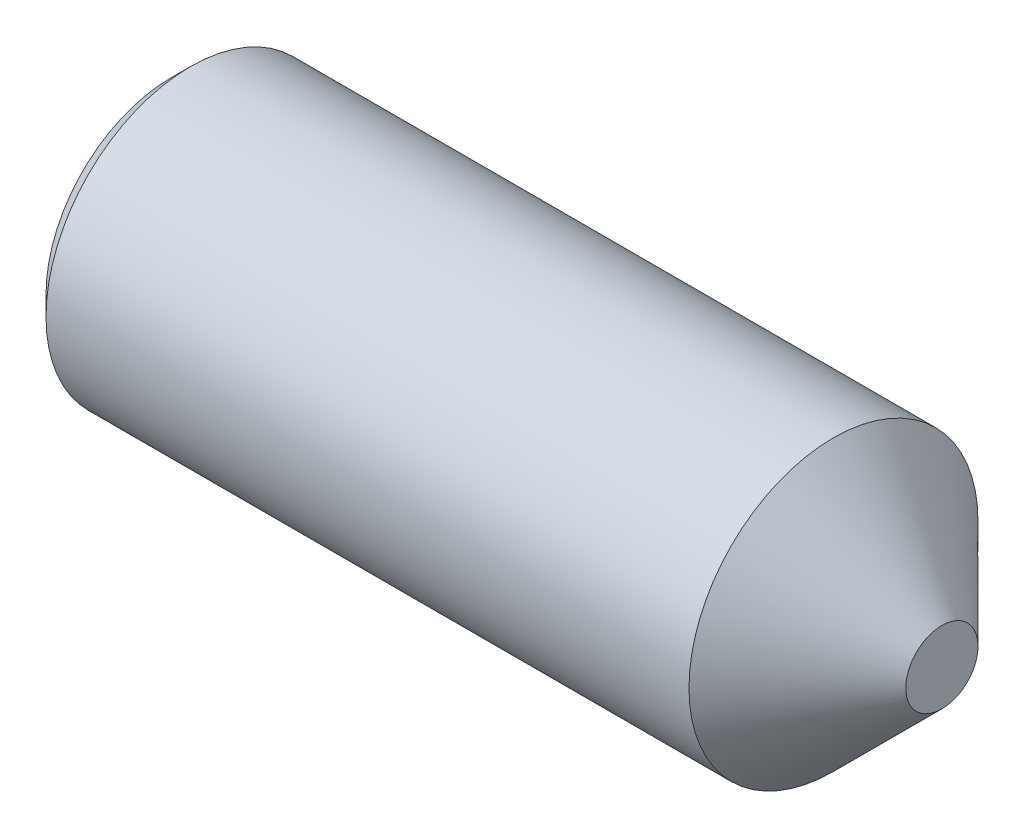
ISO-10303-21;
HEADER;
FILE_DESCRIPTION(('STEP AP214'),'2;1');
FILE_NAME('part.step','',(''),(''),'','','');
FILE_SCHEMA(('AUTOMOTIVE_DESIGN { 1 0 10303 214 1 1 1 1 }'));
ENDSEC;
DATA;
#1=APPLICATION_CONTEXT('core data for automotive mechanical design processes');
#2=APPLICATION_PROTOCOL_DEFINITION('international standard','automotive_design',2000,#1);
#3=PRODUCT_CONTEXT('',#1,'mechanical');
#4=PRODUCT('Part','Part','',(#3));
#5=PRODUCT_RELATED_PRODUCT_CATEGORY('part','',(#4));
#6=PRODUCT_DEFINITION_FORMATION('','',#4);
#7=PRODUCT_DEFINITION_CONTEXT('part definition',#1,'design');
#8=PRODUCT_DEFINITION('design','',#6,#7);
#9=PRODUCT_DEFINITION_SHAPE('','',#8);
#10=(LENGTH_UNIT() NAMED_UNIT(*) SI_UNIT(.MILLI.,.METRE.));
#11=(NAMED_UNIT(*) PLANE_ANGLE_UNIT() SI_UNIT($,.RADIAN.));
#12=(NAMED_UNIT(*) SI_UNIT($,.STERADIAN.) SOLID_ANGLE_UNIT());
#13=UNCERTAINTY_MEASURE_WITH_UNIT(LENGTH_MEASURE(1.E-05),#10,'distance_accuracy_value','');
#14=(GEOMETRIC_REPRESENTATION_CONTEXT(3) GLOBAL_UNCERTAINTY_ASSIGNED_CONTEXT((#13)) GLOBAL_UNIT_ASSIGNED_CONTEXT((#10,
#11,#12)) REPRESENTATION_CONTEXT('',''));
#15=CARTESIAN_POINT('',(0.,0.,0.));
#16=DIRECTION('',(0.,0.,1.));
#17=DIRECTION('',(1.,0.,0.));
#18=AXIS2_PLACEMENT_3D('',#15,#16,#17);
#19=CARTESIAN_POINT('',(1.20000000000042,0.,0.));
#20=DIRECTION('',(-1.,0.,0.));
#21=DIRECTION('',(0.,0.,1.));
#22=AXIS2_PLACEMENT_3D('',#19,#20,#21);
#23=CONICAL_SURFACE('',#22,0.749111974273076,1.04719755119637);
#24=CARTESIAN_POINT('',(1.63250000000004,0.,0.));
#25=VERTEX_POINT('',#24);
#26=VERTEX_LOOP('',#25);
#27=FACE_BOUND('',#26,.T.);
#28=CARTESIAN_POINT('',(1.20000000000017,0.,0.));
#29=DIRECTION('',(-1.,0.,0.));
#30=DIRECTION('',(0.,0.,1.));
#31=AXIS2_PLACEMENT_3D('',#28,#29,#30);
#32=CIRCLE('',#31,0.74911197427352);
#33=CARTESIAN_POINT('',(1.20000000000008,0.374555987136764,-0.648749999999992));
#34=VERTEX_POINT('',#33);
#35=CARTESIAN_POINT('',(1.20000000000008,0.749111974273529,0.));
#36=VERTEX_POINT('',#35);
#37=EDGE_CURVE('E19',#34,#36,#32,.F.);
#38=ORIENTED_EDGE('',*,*,#37,.F.);
#39=CARTESIAN_POINT('',(1.20000000000017,0.,0.));
#40=DIRECTION('',(-1.,0.,0.));
#41=DIRECTION('',(0.,0.,1.));
#42=AXIS2_PLACEMENT_3D('',#39,#40,#41);
#43=CIRCLE('',#42,0.74911197427352);
#44=CARTESIAN_POINT('',(1.20000000000008,-0.374555987136765,-0.648749999999992));
#45=VERTEX_POINT('',#44);
#46=EDGE_CURVE('E89',#45,#34,#43,.F.);
#47=ORIENTED_EDGE('',*,*,#46,.F.);
#48=CARTESIAN_POINT('',(1.20000000000017,0.,0.));
#49=DIRECTION('',(-1.,0.,0.));
#50=DIRECTION('',(0.,0.,1.));
#51=AXIS2_PLACEMENT_3D('',#48,#49,#50);
#52=CIRCLE('',#51,0.74911197427352);
#53=CARTESIAN_POINT('',(1.20000000000008,-0.74911197427353,0.));
#54=VERTEX_POINT('',#53);
#55=EDGE_CURVE('E113',#54,#45,#52,.F.);
#56=ORIENTED_EDGE('',*,*,#55,.F.);
#57=CARTESIAN_POINT('',(1.20000000000017,0.,0.));
#58=DIRECTION('',(-1.,0.,0.));
#59=DIRECTION('',(0.,0.,1.));
#60=AXIS2_PLACEMENT_3D('',#57,#58,#59);
#61=CIRCLE('',#60,0.74911197427352);
#62=CARTESIAN_POINT('',(1.20000000000008,-0.374555987136764,0.648749999999992));
#63=VERTEX_POINT('',#62);
#64=EDGE_CURVE('E154',#63,#54,#61,.F.);
#65=ORIENTED_EDGE('',*,*,#64,.F.);
#66=CARTESIAN_POINT('',(1.20000000000017,0.,0.));
#67=DIRECTION('',(-1.,0.,0.));
#68=DIRECTION('',(0.,0.,1.));
#69=AXIS2_PLACEMENT_3D('',#66,#67,#68);
#70=CIRCLE('',#69,0.74911197427352);
#71=CARTESIAN_POINT('',(1.20000000000008,0.374555987136764,0.648749999999992));
#72=VERTEX_POINT('',#71);
#73=EDGE_CURVE('E151',#72,#63,#70,.F.);
#74=ORIENTED_EDGE('',*,*,#73,.F.);
#75=CARTESIAN_POINT('',(1.20000000000017,0.,0.));
#76=DIRECTION('',(-1.,0.,0.));
#77=DIRECTION('',(0.,0.,1.));
#78=AXIS2_PLACEMENT_3D('',#75,#76,#77);
#79=CIRCLE('',#78,0.74911197427352);
#80=EDGE_CURVE('E92',#36,#72,#79,.F.);
#81=ORIENTED_EDGE('',*,*,#80,.F.);
#82=EDGE_LOOP('',(#38,#47,#56,#65,#74,#81));
#83=FACE_BOUND('',#82,.T.);
#84=ADVANCED_FACE('F16',(#27,#83),#23,.F.);
#85=CARTESIAN_POINT('',(1.2,0.749111974273539,1.2975));
#86=DIRECTION('',(-1.,0.,0.));
#87=DIRECTION('',(0.,0.,1.));
#88=AXIS2_PLACEMENT_3D('',#85,#86,#87);
#89=PLANE('',#88);
#90=DIRECTION('',(0.,0.,1.));
#91=VECTOR('',#90,1.);
#92=CARTESIAN_POINT('',(1.2,0.749111974273539,0.4325));
#93=LINE('',#92,#91);
#94=CARTESIAN_POINT('',(1.2,0.749111974273539,-0.432500000000001));
#95=VERTEX_POINT('',#94);
#96=EDGE_CURVE('E99',#36,#95,#93,.F.);
#97=ORIENTED_EDGE('',*,*,#96,.T.);
#98=DIRECTION('',(0.,0.866025403784439,0.5));
#99=VECTOR('',#98,1.);
#100=CARTESIAN_POINT('',(1.2,0.749111974273539,-0.432500000000001));
#101=LINE('',#100,#99);
#102=EDGE_CURVE('E97',#95,#34,#101,.F.);
#103=ORIENTED_EDGE('',*,*,#102,.T.);
#104=ORIENTED_EDGE('',*,*,#37,.T.);
#105=EDGE_LOOP('',(#97,#103,#104));
#106=FACE_BOUND('',#105,.T.);
#107=ADVANCED_FACE('F98',(#106),#89,.T.);
#108=CARTESIAN_POINT('',(1.2,0.749111974273539,1.2975));
#109=DIRECTION('',(-1.,0.,0.));
#110=DIRECTION('',(0.,0.,1.));
#111=AXIS2_PLACEMENT_3D('',#108,#109,#110);
#112=PLANE('',#111);
#113=DIRECTION('',(0.,0.866025403784439,0.5));
#114=VECTOR('',#113,1.);
#115=CARTESIAN_POINT('',(1.2,0.749111974273539,-0.432500000000001));
#116=LINE('',#115,#114);
#117=CARTESIAN_POINT('',(1.2,0.,-0.865));
#118=VERTEX_POINT('',#117);
#119=EDGE_CURVE('E104',#34,#118,#116,.F.);
#120=ORIENTED_EDGE('',*,*,#119,.T.);
#121=DIRECTION('',(0.,0.866025403784439,-0.5));
#122=VECTOR('',#121,1.);
#123=CARTESIAN_POINT('',(1.2,0.,-0.865));
#124=LINE('',#123,#122);
#125=EDGE_CURVE('E111',#118,#45,#124,.F.);
#126=ORIENTED_EDGE('',*,*,#125,.T.);
#127=ORIENTED_EDGE('',*,*,#46,.T.);
#128=EDGE_LOOP('',(#120,#126,#127));
#129=FACE_BOUND('',#128,.T.);
#130=ADVANCED_FACE('F108',(#129),#112,.T.);
#131=CARTESIAN_POINT('',(1.2,0.749111974273539,1.2975));
#132=DIRECTION('',(-1.,0.,0.));
#133=DIRECTION('',(0.,0.,1.));
#134=AXIS2_PLACEMENT_3D('',#131,#132,#133);
#135=PLANE('',#134);
#136=DIRECTION('',(0.,0.866025403784439,-0.5));
#137=VECTOR('',#136,1.);
#138=CARTESIAN_POINT('',(1.2,0.,-0.865));
#139=LINE('',#138,#137);
#140=CARTESIAN_POINT('',(1.2,-0.74911197427354,-0.4325));
#141=VERTEX_POINT('',#140);
#142=EDGE_CURVE('E161',#45,#141,#139,.F.);
#143=ORIENTED_EDGE('',*,*,#142,.T.);
#144=DIRECTION('',(0.,0.,-1.));
#145=VECTOR('',#144,1.);
#146=CARTESIAN_POINT('',(1.2,-0.74911197427354,-0.4325));
#147=LINE('',#146,#145);
#148=EDGE_CURVE('E164',#141,#54,#147,.F.);
#149=ORIENTED_EDGE('',*,*,#148,.T.);
#150=ORIENTED_EDGE('',*,*,#55,.T.);
#151=EDGE_LOOP('',(#143,#149,#150));
#152=FACE_BOUND('',#151,.T.);
#153=ADVANCED_FACE('F160',(#152),#135,.T.);
#154=CARTESIAN_POINT('',(1.2,0.749111974273539,1.2975));
#155=DIRECTION('',(-1.,0.,0.));
#156=DIRECTION('',(0.,0.,1.));
#157=AXIS2_PLACEMENT_3D('',#154,#155,#156);
#158=PLANE('',#157);
#159=DIRECTION('',(0.,0.,-1.));
#160=VECTOR('',#159,1.);
#161=CARTESIAN_POINT('',(1.2,-0.74911197427354,-0.4325));
#162=LINE('',#161,#160);
#163=CARTESIAN_POINT('',(1.2,-0.74911197427354,0.432499999999999));
#164=VERTEX_POINT('',#163);
#165=EDGE_CURVE('E195',#54,#164,#162,.F.);
#166=ORIENTED_EDGE('',*,*,#165,.T.);
#167=DIRECTION('',(0.,-0.866025403784439,-0.5));
#168=VECTOR('',#167,1.);
#169=CARTESIAN_POINT('',(1.2,-0.74911197427354,0.432499999999999));
#170=LINE('',#169,#168);
#171=EDGE_CURVE('E201',#164,#63,#170,.F.);
#172=ORIENTED_EDGE('',*,*,#171,.T.);
#173=ORIENTED_EDGE('',*,*,#64,.T.);
#174=EDGE_LOOP('',(#166,#172,#173));
#175=FACE_BOUND('',#174,.T.);
#176=ADVANCED_FACE('F385',(#175),#158,.T.);
#177=CARTESIAN_POINT('',(1.2,0.749111974273539,1.2975));
#178=DIRECTION('',(-1.,0.,0.));
#179=DIRECTION('',(0.,0.,1.));
#180=AXIS2_PLACEMENT_3D('',#177,#178,#179);
#181=PLANE('',#180);
#182=DIRECTION('',(0.,-0.866025403784439,-0.5));
#183=VECTOR('',#182,1.);
#184=CARTESIAN_POINT('',(1.2,-0.74911197427354,0.432499999999999));
#185=LINE('',#184,#183);
#186=CARTESIAN_POINT('',(1.2,0.,0.864999999999999));
#187=VERTEX_POINT('',#186);
#188=EDGE_CURVE('E209',#63,#187,#185,.F.);
#189=ORIENTED_EDGE('',*,*,#188,.T.);
#190=DIRECTION('',(0.,-0.866025403784439,0.5));
#191=VECTOR('',#190,1.);
#192=CARTESIAN_POINT('',(1.2,0.,0.864999999999999));
#193=LINE('',#192,#191);
#194=EDGE_CURVE('E223',#187,#72,#193,.F.);
#195=ORIENTED_EDGE('',*,*,#194,.T.);
#196=ORIENTED_EDGE('',*,*,#73,.T.);
#197=EDGE_LOOP('',(#189,#195,#196));
#198=FACE_BOUND('',#197,.T.);
#199=ADVANCED_FACE('F274',(#198),#181,.T.);
#200=CARTESIAN_POINT('',(1.2,0.749111974273539,1.2975));
#201=DIRECTION('',(-1.,0.,0.));
#202=DIRECTION('',(0.,0.,1.));
#203=AXIS2_PLACEMENT_3D('',#200,#201,#202);
#204=PLANE('',#203);
#205=DIRECTION('',(0.,-0.866025403784439,0.5));
#206=VECTOR('',#205,1.);
#207=CARTESIAN_POINT('',(1.2,0.,0.864999999999999));
#208=LINE('',#207,#206);
#209=CARTESIAN_POINT('',(1.2,0.749111974273539,0.4325));
#210=VERTEX_POINT('',#209);
#211=EDGE_CURVE('E228',#72,#210,#208,.F.);
#212=ORIENTED_EDGE('',*,*,#211,.T.);
#213=DIRECTION('',(0.,0.,1.));
#214=VECTOR('',#213,1.);
#215=CARTESIAN_POINT('',(1.2,0.749111974273539,0.4325));
#216=LINE('',#215,#214);
#217=EDGE_CURVE('E136',#210,#36,#216,.F.);
#218=ORIENTED_EDGE('',*,*,#217,.T.);
#219=ORIENTED_EDGE('',*,*,#80,.T.);
#220=EDGE_LOOP('',(#212,#218,#219));
#221=FACE_BOUND('',#220,.T.);
#222=ADVANCED_FACE('F272',(#221),#204,.T.);
#223=CARTESIAN_POINT('',(1.2,0.749111974273539,0.4325));
#224=DIRECTION('',(0.,1.,0.));
#225=DIRECTION('',(0.,0.,1.));
#226=AXIS2_PLACEMENT_3D('',#223,#224,#225);
#227=PLANE('',#226);
#228=DIRECTION('',(1.,0.,0.));
#229=VECTOR('',#228,1.);
#230=CARTESIAN_POINT('',(1.2,0.749111974273539,-0.432500000000001));
#231=LINE('',#230,#229);
#232=CARTESIAN_POINT('',(0.,0.749111974273539,-0.432500000000001));
#233=VERTEX_POINT('',#232);
#234=EDGE_CURVE('E105',#233,#95,#231,.T.);
#235=ORIENTED_EDGE('',*,*,#234,.T.);
#236=ORIENTED_EDGE('',*,*,#96,.F.);
#237=ORIENTED_EDGE('',*,*,#217,.F.);
#238=DIRECTION('',(1.,0.,0.));
#239=VECTOR('',#238,1.);
#240=CARTESIAN_POINT('',(1.2,0.749111974273539,0.4325));
#241=LINE('',#240,#239);
#242=CARTESIAN_POINT('',(0.,0.749111974273539,0.4325));
#243=VERTEX_POINT('',#242);
#244=EDGE_CURVE('E140',#210,#243,#241,.F.);
#245=ORIENTED_EDGE('',*,*,#244,.T.);
#246=DIRECTION('',(0.,0.,-1.));
#247=VECTOR('',#246,1.);
#248=CARTESIAN_POINT('',(0.,0.749111974273539,0.));
#249=LINE('',#248,#247);
#250=EDGE_CURVE('E127',#243,#233,#249,.T.);
#251=ORIENTED_EDGE('',*,*,#250,.T.);
#252=EDGE_LOOP('',(#235,#236,#237,#245,#251));
#253=FACE_BOUND('',#252,.T.);
#254=ADVANCED_FACE('F270',(#253),#227,.F.);
#255=CARTESIAN_POINT('',(1.2,0.749111974273539,-0.432500000000001));
#256=DIRECTION('',(0.,0.5,-0.866025403784439));
#257=DIRECTION('',(0.,0.866025403784439,0.5));
#258=AXIS2_PLACEMENT_3D('',#255,#256,#257);
#259=PLANE('',#258);
#260=DIRECTION('',(1.,0.,0.));
#261=VECTOR('',#260,1.);
#262=CARTESIAN_POINT('',(1.2,0.,-0.865));
#263=LINE('',#262,#261);
#264=CARTESIAN_POINT('',(0.,0.,-0.865));
#265=VERTEX_POINT('',#264);
#266=EDGE_CURVE('E116',#265,#118,#263,.T.);
#267=ORIENTED_EDGE('',*,*,#266,.T.);
#268=ORIENTED_EDGE('',*,*,#119,.F.);
#269=ORIENTED_EDGE('',*,*,#102,.F.);
#270=ORIENTED_EDGE('',*,*,#234,.F.);
#271=DIRECTION('',(0.,-0.866025403784439,-0.5));
#272=VECTOR('',#271,1.);
#273=CARTESIAN_POINT('',(0.,0.749111974273539,-0.432500000000001));
#274=LINE('',#273,#272);
#275=EDGE_CURVE('E124',#233,#265,#274,.T.);
#276=ORIENTED_EDGE('',*,*,#275,.T.);
#277=EDGE_LOOP('',(#267,#268,#269,#270,#276));
#278=FACE_BOUND('',#277,.T.);
#279=ADVANCED_FACE('F114',(#278),#259,.F.);
#280=CARTESIAN_POINT('',(1.2,0.,-0.865));
#281=DIRECTION('',(0.,-0.5,-0.866025403784439));
#282=DIRECTION('',(0.,0.866025403784439,-0.5));
#283=AXIS2_PLACEMENT_3D('',#280,#281,#282);
#284=PLANE('',#283);
#285=DIRECTION('',(1.,0.,0.));
#286=VECTOR('',#285,1.);
#287=CARTESIAN_POINT('',(1.2,-0.74911197427354,-0.4325));
#288=LINE('',#287,#286);
#289=CARTESIAN_POINT('',(0.,-0.74911197427354,-0.4325));
#290=VERTEX_POINT('',#289);
#291=EDGE_CURVE('E168',#290,#141,#288,.T.);
#292=ORIENTED_EDGE('',*,*,#291,.T.);
#293=ORIENTED_EDGE('',*,*,#142,.F.);
#294=ORIENTED_EDGE('',*,*,#125,.F.);
#295=ORIENTED_EDGE('',*,*,#266,.F.);
#296=DIRECTION('',(0.,-0.866025403784439,0.5));
#297=VECTOR('',#296,1.);
#298=CARTESIAN_POINT('',(0.,0.,-0.865));
#299=LINE('',#298,#297);
#300=EDGE_CURVE('E126',#265,#290,#299,.T.);
#301=ORIENTED_EDGE('',*,*,#300,.T.);
#302=EDGE_LOOP('',(#292,#293,#294,#295,#301));
#303=FACE_BOUND('',#302,.T.);
#304=ADVANCED_FACE('F166',(#303),#284,.F.);
#305=CARTESIAN_POINT('',(1.2,-0.74911197427354,-0.4325));
#306=DIRECTION('',(0.,-1.,0.));
#307=DIRECTION('',(0.,0.,-1.));
#308=AXIS2_PLACEMENT_3D('',#305,#306,#307);
#309=PLANE('',#308);
#310=DIRECTION('',(1.,0.,0.));
#311=VECTOR('',#310,1.);
#312=CARTESIAN_POINT('',(1.2,-0.74911197427354,0.432499999999999));
#313=LINE('',#312,#311);
#314=CARTESIAN_POINT('',(0.,-0.74911197427354,0.432499999999999));
#315=VERTEX_POINT('',#314);
#316=EDGE_CURVE('E197',#315,#164,#313,.T.);
#317=ORIENTED_EDGE('',*,*,#316,.T.);
#318=ORIENTED_EDGE('',*,*,#165,.F.);
#319=ORIENTED_EDGE('',*,*,#148,.F.);
#320=ORIENTED_EDGE('',*,*,#291,.F.);
#321=DIRECTION('',(0.,0.,-1.));
#322=VECTOR('',#321,1.);
#323=CARTESIAN_POINT('',(0.,-0.74911197427354,0.));
#324=LINE('',#323,#322);
#325=EDGE_CURVE('E178',#290,#315,#324,.F.);
#326=ORIENTED_EDGE('',*,*,#325,.T.);
#327=EDGE_LOOP('',(#317,#318,#319,#320,#326));
#328=FACE_BOUND('',#327,.T.);
#329=ADVANCED_FACE('F279',(#328),#309,.F.);
#330=CARTESIAN_POINT('',(1.2,-0.74911197427354,0.432499999999999));
#331=DIRECTION('',(0.,-0.5,0.866025403784439));
#332=DIRECTION('',(0.,-0.866025403784439,-0.5));
#333=AXIS2_PLACEMENT_3D('',#330,#331,#332);
#334=PLANE('',#333);
#335=DIRECTION('',(1.,0.,0.));
#336=VECTOR('',#335,1.);
#337=CARTESIAN_POINT('',(1.2,0.,0.864999999999999));
#338=LINE('',#337,#336);
#339=CARTESIAN_POINT('',(0.,0.,0.864999999999999));
#340=VERTEX_POINT('',#339);
#341=EDGE_CURVE('E219',#340,#187,#338,.T.);
#342=ORIENTED_EDGE('',*,*,#341,.T.);
#343=ORIENTED_EDGE('',*,*,#188,.F.);
#344=ORIENTED_EDGE('',*,*,#171,.F.);
#345=ORIENTED_EDGE('',*,*,#316,.F.);
#346=DIRECTION('',(0.,0.866025403784439,0.5));
#347=VECTOR('',#346,1.);
#348=CARTESIAN_POINT('',(0.,-0.74911197427354,0.432499999999999));
#349=LINE('',#348,#347);
#350=EDGE_CURVE('E34',#315,#340,#349,.T.);
#351=ORIENTED_EDGE('',*,*,#350,.T.);
#352=EDGE_LOOP('',(#342,#343,#344,#345,#351));
#353=FACE_BOUND('',#352,.T.);
#354=ADVANCED_FACE('F277',(#353),#334,.F.);
#355=CARTESIAN_POINT('',(1.2,0.,0.864999999999999));
#356=DIRECTION('',(0.,0.5,0.866025403784439));
#357=DIRECTION('',(0.,-0.866025403784439,0.5));
#358=AXIS2_PLACEMENT_3D('',#355,#356,#357);
#359=PLANE('',#358);
#360=ORIENTED_EDGE('',*,*,#244,.F.);
#361=ORIENTED_EDGE('',*,*,#211,.F.);
#362=ORIENTED_EDGE('',*,*,#194,.F.);
#363=ORIENTED_EDGE('',*,*,#341,.F.);
#364=DIRECTION('',(0.,0.866025403784439,-0.5));
#365=VECTOR('',#364,1.);
#366=CARTESIAN_POINT('',(0.,0.,0.864999999999999));
#367=LINE('',#366,#365);
#368=EDGE_CURVE('E149',#340,#243,#367,.T.);
#369=ORIENTED_EDGE('',*,*,#368,.T.);
#370=EDGE_LOOP('',(#360,#361,#362,#363,#369));
#371=FACE_BOUND('',#370,.T.);
#372=ADVANCED_FACE('F259',(#371),#359,.F.);
#373=CARTESIAN_POINT('',(0.,1.299,0.));
#374=DIRECTION('',(1.,0.,0.));
#375=DIRECTION('',(0.,0.,-1.));
#376=AXIS2_PLACEMENT_3D('',#373,#374,#375);
#377=PLANE('',#376);
#378=CARTESIAN_POINT('',(0.,0.,0.));
#379=DIRECTION('',(1.,0.,0.));
#380=DIRECTION('',(0.,1.,0.));
#381=AXIS2_PLACEMENT_3D('',#378,#379,#380);
#382=CIRCLE('',#381,1.29899999996042);
#383=CARTESIAN_POINT('',(0.,1.29899999996042,0.));
#384=VERTEX_POINT('',#383);
#385=EDGE_CURVE('E146',#384,#384,#382,.T.);
#386=ORIENTED_EDGE('',*,*,#385,.F.);
#387=EDGE_LOOP('',(#386));
#388=FACE_BOUND('',#387,.T.);
#389=ORIENTED_EDGE('',*,*,#350,.F.);
#390=ORIENTED_EDGE('',*,*,#325,.F.);
#391=ORIENTED_EDGE('',*,*,#300,.F.);
#392=ORIENTED_EDGE('',*,*,#275,.F.);
#393=ORIENTED_EDGE('',*,*,#250,.F.);
#394=ORIENTED_EDGE('',*,*,#368,.F.);
#395=EDGE_LOOP('',(#389,#390,#391,#392,#393,#394));
#396=FACE_BOUND('',#395,.T.);
#397=ADVANCED_FACE('F256',(#388,#396),#377,.F.);
#398=CARTESIAN_POINT('',(8.,0.,0.));
#399=DIRECTION('',(-1.,0.,0.));
#400=DIRECTION('',(0.,0.,1.));
#401=AXIS2_PLACEMENT_3D('',#398,#399,#400);
#402=PLANE('',#401);
#403=CARTESIAN_POINT('',(8.0000000000382,0.,0.));
#404=DIRECTION('',(-1.,0.,0.));
#405=DIRECTION('',(0.,-1.,0.));
#406=AXIS2_PLACEMENT_3D('',#403,#404,#405);
#407=CIRCLE('',#406,0.374999999962711);
#408=CARTESIAN_POINT('',(8.0000000000382,-0.37499999996271,0.));
#409=VERTEX_POINT('',#408);
#410=EDGE_CURVE('E143',#409,#409,#407,.T.);
#411=ORIENTED_EDGE('',*,*,#410,.F.);
#412=EDGE_LOOP('',(#411));
#413=FACE_BOUND('',#412,.T.);
#414=ADVANCED_FACE('F252',(#413),#402,.F.);
#415=CARTESIAN_POINT('',(0.200999999947271,0.,0.));
#416=DIRECTION('',(1.,0.,0.));
#417=DIRECTION('',(0.,1.,0.));
#418=AXIS2_PLACEMENT_3D('',#415,#416,#417);
#419=CONICAL_SURFACE('',#418,1.49999999990769,0.785398163397448);
#420=CARTESIAN_POINT('',(0.200999999999998,0.,0.));
#421=DIRECTION('',(-1.,0.,0.));
#422=DIRECTION('',(0.,0.,1.));
#423=AXIS2_PLACEMENT_3D('',#420,#421,#422);
#424=CIRCLE('',#423,1.5);
#425=CARTESIAN_POINT('',(0.200999999999998,0.,1.5));
#426=VERTEX_POINT('',#425);
#427=EDGE_CURVE('E25',#426,#426,#424,.F.);
#428=ORIENTED_EDGE('',*,*,#427,.F.);
#429=EDGE_LOOP('',(#428));
#430=FACE_BOUND('',#429,.T.);
#431=ORIENTED_EDGE('',*,*,#385,.T.);
#432=EDGE_LOOP('',(#431));
#433=FACE_BOUND('',#432,.T.);
#434=ADVANCED_FACE('F248',(#430,#433),#419,.T.);
#435=CARTESIAN_POINT('',(6.87500000009322,0.,0.));
#436=DIRECTION('',(-1.,0.,0.));
#437=DIRECTION('',(0.,-1.,0.));
#438=AXIS2_PLACEMENT_3D('',#435,#436,#437);
#439=CONICAL_SURFACE('',#438,1.49999999990769,0.785398163397448);
#440=CARTESIAN_POINT('',(6.87499999999999,0.,0.));
#441=DIRECTION('',(-1.,0.,0.));
#442=DIRECTION('',(0.,0.,1.));
#443=AXIS2_PLACEMENT_3D('',#440,#441,#442);
#444=CIRCLE('',#443,1.5);
#445=CARTESIAN_POINT('',(6.87499999999999,-1.50000000000092,0.));
#446=VERTEX_POINT('',#445);
#447=EDGE_CURVE('E11',#446,#446,#444,.T.);
#448=CARTESIAN_POINT('',(8.0000000000382,-0.37499999996271,0.));
#449=CARTESIAN_POINT('',(7.9882812500378,-0.386718749963108,0.));
#450=CARTESIAN_POINT('',(7.9765625000374,-0.398437499963506,0.));
#451=CARTESIAN_POINT('',(7.95312500003661,-0.421874999964302,0.));
#452=CARTESIAN_POINT('',(7.94140625003621,-0.4335937499647,0.));
#453=CARTESIAN_POINT('',(7.91796875003541,-0.457031249965496,0.));
#454=CARTESIAN_POINT('',(7.90625000003502,-0.468749999965894,0.));
#455=CARTESIAN_POINT('',(7.88281250003422,-0.49218749996669,0.));
#456=CARTESIAN_POINT('',(7.87109375003382,-0.503906249967088,0.));
#457=CARTESIAN_POINT('',(7.84765625003303,-0.527343749967884,0.));
#458=CARTESIAN_POINT('',(7.83593750003263,-0.539062499968282,0.));
#459=CARTESIAN_POINT('',(7.81250000003183,-0.562499999969078,0.));
#460=CARTESIAN_POINT('',(7.80078125003143,-0.574218749969476,0.));
#461=CARTESIAN_POINT('',(7.77734375003064,-0.597656249970272,0.));
#462=CARTESIAN_POINT('',(7.76562500003024,-0.60937499997067,0.));
#463=CARTESIAN_POINT('',(7.74218750002944,-0.632812499971466,0.));
#464=CARTESIAN_POINT('',(7.73046875002905,-0.644531249971864,0.));
#465=CARTESIAN_POINT('',(7.70703125002825,-0.66796874997266,0.));
#466=CARTESIAN_POINT('',(7.69531250002785,-0.679687499973058,0.));
#467=CARTESIAN_POINT('',(7.67187500002706,-0.703124999973854,0.));
#468=CARTESIAN_POINT('',(7.66015625002666,-0.714843749974252,0.));
#469=CARTESIAN_POINT('',(7.63671875002586,-0.738281249975048,0.));
#470=CARTESIAN_POINT('',(7.62500000002546,-0.749999999975446,0.));
#471=CARTESIAN_POINT('',(7.60156250002467,-0.773437499976242,0.));
#472=CARTESIAN_POINT('',(7.58984375002427,-0.78515624997664,0.));
#473=CARTESIAN_POINT('',(7.56640625002347,-0.808593749977436,0.));
#474=CARTESIAN_POINT('',(7.55468750002307,-0.820312499977834,0.));
#475=CARTESIAN_POINT('',(7.53125000002228,-0.84374999997863,0.));
#476=CARTESIAN_POINT('',(7.51953125002188,-0.855468749979028,0.));
#477=CARTESIAN_POINT('',(7.49609375002109,-0.878906249979824,0.));
#478=CARTESIAN_POINT('',(7.48437500002069,-0.890624999980222,0.));
#479=CARTESIAN_POINT('',(7.46093750001989,-0.914062499981018,0.));
#480=CARTESIAN_POINT('',(7.44921875001949,-0.925781249981416,0.));
#481=CARTESIAN_POINT('',(7.4257812500187,-0.949218749982212,0.));
#482=CARTESIAN_POINT('',(7.4140625000183,-0.96093749998261,0.));
#483=CARTESIAN_POINT('',(7.3906250000175,-0.984374999983406,0.));
#484=CARTESIAN_POINT('',(7.37890625001711,-0.996093749983804,0.));
#485=CARTESIAN_POINT('',(7.35546875001631,-1.0195312499846,0.));
#486=CARTESIAN_POINT('',(7.34375000001591,-1.031249999985,0.));
#487=CARTESIAN_POINT('',(7.32031250001512,-1.05468749998579,0.));
#488=CARTESIAN_POINT('',(7.30859375001472,-1.06640624998619,0.));
#489=CARTESIAN_POINT('',(7.28515625001392,-1.08984374998699,0.));
#490=CARTESIAN_POINT('',(7.27343750001352,-1.10156249998739,0.));
#491=CARTESIAN_POINT('',(7.25000000001273,-1.12499999998818,0.));
#492=CARTESIAN_POINT('',(7.23828125001233,-1.13671874998858,0.));
#493=CARTESIAN_POINT('',(7.21484375001153,-1.16015624998938,0.));
#494=CARTESIAN_POINT('',(7.20312500001113,-1.17187499998977,0.));
#495=CARTESIAN_POINT('',(7.17968750001034,-1.19531249999057,0.));
#496=CARTESIAN_POINT('',(7.16796875000994,-1.20703124999097,0.));
#497=CARTESIAN_POINT('',(7.14453125000915,-1.23046874999176,0.));
#498=CARTESIAN_POINT('',(7.13281250000875,-1.24218749999216,0.));
#499=CARTESIAN_POINT('',(7.10937500000795,-1.26562499999296,0.));
#500=CARTESIAN_POINT('',(7.09765625000755,-1.27734374999336,0.));
#501=CARTESIAN_POINT('',(7.07421875000676,-1.30078124999415,0.));
#502=CARTESIAN_POINT('',(7.06250000000636,-1.31249999999455,0.));
#503=CARTESIAN_POINT('',(7.03906250000556,-1.33593749999535,0.));
#504=CARTESIAN_POINT('',(7.02734375000516,-1.34765624999574,0.));
#505=CARTESIAN_POINT('',(7.00390625000437,-1.37109374999654,0.));
#506=CARTESIAN_POINT('',(6.99218750000397,-1.38281249999694,0.));
#507=CARTESIAN_POINT('',(6.96875000000318,-1.40624999999773,0.));
#508=CARTESIAN_POINT('',(6.95703125000278,-1.41796874999813,0.));
#509=CARTESIAN_POINT('',(6.93359375000198,-1.44140624999893,0.));
#510=CARTESIAN_POINT('',(6.92187500000158,-1.45312499999933,0.));
#511=CARTESIAN_POINT('',(6.89843750000079,-1.47656250000012,0.));
#512=CARTESIAN_POINT('',(6.88671875000039,-1.48828125000052,0.));
#513=CARTESIAN_POINT('',(6.87499999999999,-1.50000000000092,0.));
#514=B_SPLINE_CURVE_WITH_KNOTS('',3,(#448,#449,#450,#451,#452,#453,#454,#455,#456,#457,#458,
#459,#460,#461,#462,#463,#464,#465,#466,#467,#468,#469,#470,#471,#472,#473,#474,#475,#476,#477,
#478,#479,#480,#481,#482,#483,#484,#485,#486,#487,#488,#489,#490,#491,#492,#493,#494,#495,#496,
#497,#498,#499,#500,#501,#502,#503,#504,#505,#506,#507,#508,#509,#510,#511,#512,#513),
.UNSPECIFIED.,.F.,.F.,(4,2,2,2,2,2,2,2,2,2,2,2,2,2,2,2,2,2,2,2,2,2,2,2,2,2,2,2,2,2,2,2,4),(0.,
0.049718445553867,0.0994368911077354,0.149155336661602,0.198873782215471,0.248592227769338,
0.298310673323206,0.348029118877073,0.397747564430941,0.447466009984809,0.497184455538677,
0.546902901092544,0.596621346646412,0.64633979220028,0.696058237754147,0.745776683308015,
0.795495128861883,0.845213574415751,0.894932019969618,0.944650465523486,0.994368911077353,
1.04408735663122,1.09380580218509,1.14352424773896,1.19324269329282,1.24296113884669,
1.29267958440056,1.34239802995443,1.3921164755083,1.44183492106216,1.49155336661603,
1.5412718121699,1.59099025772377),.UNSPECIFIED.);
#515=EDGE_CURVE('BSEAM251',#409,#446,#514,.T.);
#516=ORIENTED_EDGE('',*,*,#410,.T.);
#517=ORIENTED_EDGE('',*,*,#447,.F.);
#518=ORIENTED_EDGE('',*,*,#515,.T.);
#519=ORIENTED_EDGE('',*,*,#515,.F.);
#520=EDGE_LOOP('',(#516,#518,#517,#519));
#521=FACE_BOUND('',#520,.T.);
#522=ADVANCED_FACE('F251',(#521),#439,.T.);
#523=CARTESIAN_POINT('',(-1.4104518001455,0.,0.));
#524=DIRECTION('',(-1.,0.,0.));
#525=DIRECTION('',(0.,0.,1.));
#526=AXIS2_PLACEMENT_3D('',#523,#524,#525);
#527=CYLINDRICAL_SURFACE('',#526,1.5);
#528=ORIENTED_EDGE('',*,*,#447,.T.);
#529=EDGE_LOOP('',(#528));
#530=FACE_BOUND('',#529,.T.);
#531=ORIENTED_EDGE('',*,*,#427,.T.);
#532=EDGE_LOOP('',(#531));
#533=FACE_BOUND('',#532,.T.);
#534=ADVANCED_FACE('F246',(#530,#533),#527,.T.);
#535=CLOSED_SHELL('',(#84,#107,#130,#153,#176,#199,#222,#254,#279,#304,#329,#354,#372,#397,#414,
#434,#522,#534));
#536=MANIFOLD_SOLID_BREP('B1',#535);
#537=ADVANCED_BREP_SHAPE_REPRESENTATION('',(#18,#536),#14);
#538=SHAPE_DEFINITION_REPRESENTATION(#9,#537);
ENDSEC;
END-ISO-10303-21;
